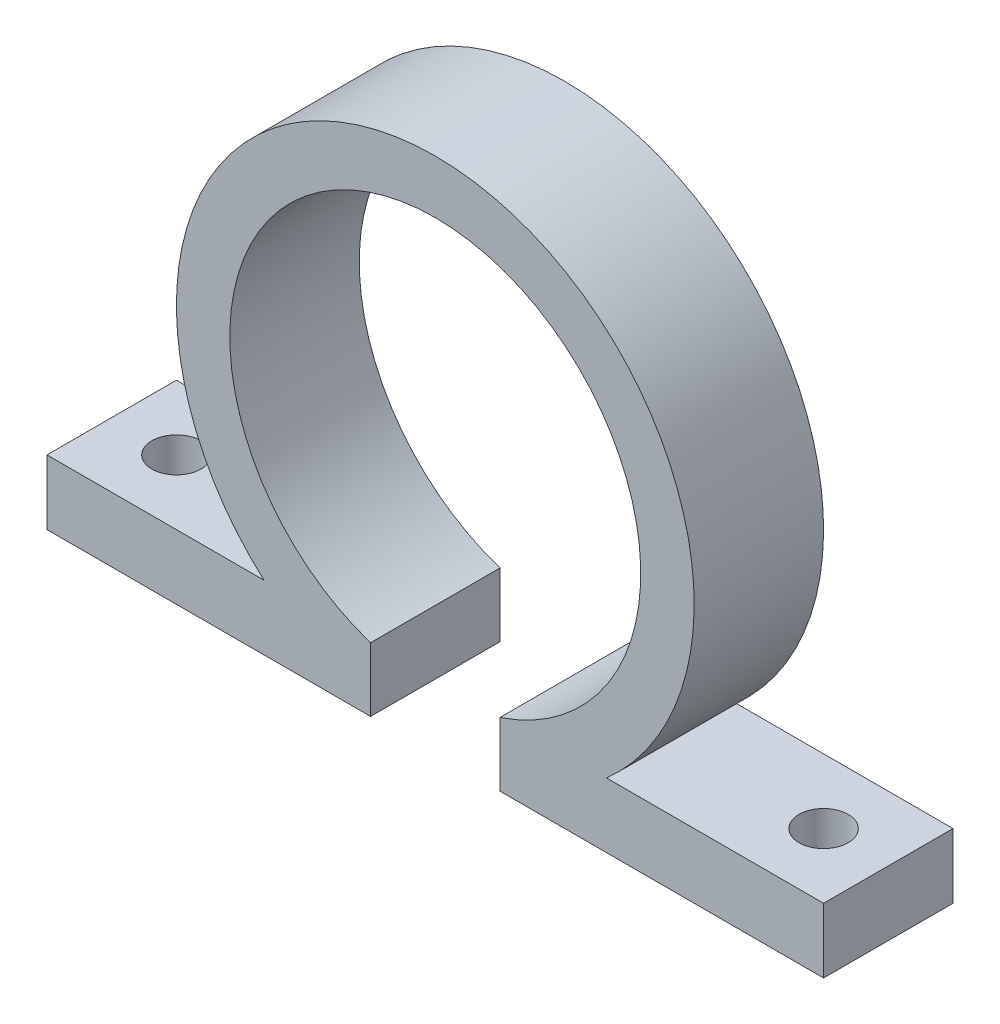
ISO-10303-21;
HEADER;
FILE_DESCRIPTION(('STEP AP214'),'2;1');
FILE_NAME('part.step','',(''),(''),'','','');
FILE_SCHEMA(('AUTOMOTIVE_DESIGN { 1 0 10303 214 1 1 1 1 }'));
ENDSEC;
DATA;
#1=APPLICATION_CONTEXT('core data for automotive mechanical design processes');
#2=APPLICATION_PROTOCOL_DEFINITION('international standard','automotive_design',2000,#1);
#3=PRODUCT_CONTEXT('',#1,'mechanical');
#4=PRODUCT('Part','Part','',(#3));
#5=PRODUCT_RELATED_PRODUCT_CATEGORY('part','',(#4));
#6=PRODUCT_DEFINITION_FORMATION('','',#4);
#7=PRODUCT_DEFINITION_CONTEXT('part definition',#1,'design');
#8=PRODUCT_DEFINITION('design','',#6,#7);
#9=PRODUCT_DEFINITION_SHAPE('','',#8);
#10=(LENGTH_UNIT() NAMED_UNIT(*) SI_UNIT(.MILLI.,.METRE.));
#11=(NAMED_UNIT(*) PLANE_ANGLE_UNIT() SI_UNIT($,.RADIAN.));
#12=(NAMED_UNIT(*) SI_UNIT($,.STERADIAN.) SOLID_ANGLE_UNIT());
#13=UNCERTAINTY_MEASURE_WITH_UNIT(LENGTH_MEASURE(1.E-05),#10,'distance_accuracy_value','');
#14=(GEOMETRIC_REPRESENTATION_CONTEXT(3) GLOBAL_UNCERTAINTY_ASSIGNED_CONTEXT((#13)) GLOBAL_UNIT_ASSIGNED_CONTEXT((#10,
#11,#12)) REPRESENTATION_CONTEXT('',''));
#15=CARTESIAN_POINT('',(0.,0.,0.));
#16=DIRECTION('',(0.,0.,1.));
#17=DIRECTION('',(1.,0.,0.));
#18=AXIS2_PLACEMENT_3D('',#15,#16,#17);
#19=CARTESIAN_POINT('',(-30.,-20.,10.));
#20=DIRECTION('',(0.,-1.,0.));
#21=DIRECTION('',(1.,0.,0.));
#22=AXIS2_PLACEMENT_3D('',#19,#20,#21);
#23=PLANE('',#22);
#24=CARTESIAN_POINT('',(-25.,-20.,5.));
#25=DIRECTION('',(0.,1.,0.));
#26=DIRECTION('',(0.,0.,1.));
#27=AXIS2_PLACEMENT_3D('',#24,#25,#26);
#28=CIRCLE('',#27,1.89865);
#29=CARTESIAN_POINT('',(-25.,-20.,6.89865));
#30=VERTEX_POINT('',#29);
#31=EDGE_CURVE('E190',#30,#30,#28,.T.);
#32=ORIENTED_EDGE('',*,*,#31,.T.);
#33=EDGE_LOOP('',(#32));
#34=FACE_BOUND('',#33,.T.);
#35=DIRECTION('',(0.,0.,1.));
#36=VECTOR('',#35,1.);
#37=CARTESIAN_POINT('',(-5.,-20.,0.));
#38=LINE('',#37,#36);
#39=CARTESIAN_POINT('',(-5.,-20.,0.));
#40=VERTEX_POINT('',#39);
#41=CARTESIAN_POINT('',(-5.,-20.,10.));
#42=VERTEX_POINT('',#41);
#43=EDGE_CURVE('E107',#40,#42,#38,.T.);
#44=ORIENTED_EDGE('',*,*,#43,.T.);
#45=DIRECTION('',(-1.,0.,0.));
#46=VECTOR('',#45,1.);
#47=CARTESIAN_POINT('',(-30.,-20.,10.));
#48=LINE('',#47,#46);
#49=CARTESIAN_POINT('',(-30.,-20.,10.));
#50=VERTEX_POINT('',#49);
#51=EDGE_CURVE('E172',#42,#50,#48,.T.);
#52=ORIENTED_EDGE('',*,*,#51,.T.);
#53=DIRECTION('',(0.,0.,-1.));
#54=VECTOR('',#53,1.);
#55=CARTESIAN_POINT('',(-30.,-20.,10.));
#56=LINE('',#55,#54);
#57=CARTESIAN_POINT('',(-30.,-20.,0.));
#58=VERTEX_POINT('',#57);
#59=EDGE_CURVE('E128',#50,#58,#56,.T.);
#60=ORIENTED_EDGE('',*,*,#59,.T.);
#61=DIRECTION('',(-1.,0.,0.));
#62=VECTOR('',#61,1.);
#63=CARTESIAN_POINT('',(-30.,-20.,0.));
#64=LINE('',#63,#62);
#65=EDGE_CURVE('E121',#40,#58,#64,.T.);
#66=ORIENTED_EDGE('',*,*,#65,.F.);
#67=EDGE_LOOP('',(#44,#52,#60,#66));
#68=FACE_BOUND('',#67,.T.);
#69=ADVANCED_FACE('F32',(#34,#68),#23,.T.);
#70=CARTESIAN_POINT('',(0.,0.,10.));
#71=DIRECTION('',(0.,0.,-1.));
#72=DIRECTION('',(-1.,0.,0.));
#73=AXIS2_PLACEMENT_3D('',#70,#71,#72);
#74=CYLINDRICAL_SURFACE('',#73,20.);
#75=CARTESIAN_POINT('',(0.,0.,10.));
#76=DIRECTION('',(0.,0.,1.));
#77=DIRECTION('',(1.,0.,0.));
#78=AXIS2_PLACEMENT_3D('',#75,#76,#77);
#79=CIRCLE('',#78,20.);
#80=CARTESIAN_POINT('',(13.228756555323,-15.,10.));
#81=VERTEX_POINT('',#80);
#82=CARTESIAN_POINT('',(-13.228756555323,-15.,10.));
#83=VERTEX_POINT('',#82);
#84=EDGE_CURVE('E11',#81,#83,#79,.T.);
#85=ORIENTED_EDGE('',*,*,#84,.F.);
#86=DIRECTION('',(0.,0.,-1.));
#87=VECTOR('',#86,1.);
#88=CARTESIAN_POINT('',(13.228756555323,-15.,10.));
#89=LINE('',#88,#87);
#90=CARTESIAN_POINT('',(13.2287565553229,-15.,0.));
#91=VERTEX_POINT('',#90);
#92=EDGE_CURVE('E152',#81,#91,#89,.T.);
#93=ORIENTED_EDGE('',*,*,#92,.T.);
#94=CARTESIAN_POINT('',(0.,0.,0.));
#95=DIRECTION('',(0.,0.,1.));
#96=DIRECTION('',(1.,0.,0.));
#97=AXIS2_PLACEMENT_3D('',#94,#95,#96);
#98=CIRCLE('',#97,20.);
#99=CARTESIAN_POINT('',(-13.228756555323,-15.,0.));
#100=VERTEX_POINT('',#99);
#101=EDGE_CURVE('E36',#91,#100,#98,.T.);
#102=ORIENTED_EDGE('',*,*,#101,.T.);
#103=DIRECTION('',(0.,0.,-1.));
#104=VECTOR('',#103,1.);
#105=CARTESIAN_POINT('',(-13.228756555323,-15.,10.));
#106=LINE('',#105,#104);
#107=EDGE_CURVE('E141',#100,#83,#106,.F.);
#108=ORIENTED_EDGE('',*,*,#107,.T.);
#109=EDGE_LOOP('',(#85,#93,#102,#108));
#110=FACE_BOUND('',#109,.T.);
#111=ADVANCED_FACE('F34',(#110),#74,.T.);
#112=CARTESIAN_POINT('',(0.,0.,10.));
#113=DIRECTION('',(0.,0.,1.));
#114=DIRECTION('',(1.,0.,0.));
#115=AXIS2_PLACEMENT_3D('',#112,#113,#114);
#116=PLANE('',#115);
#117=DIRECTION('',(0.,-1.,0.));
#118=VECTOR('',#117,1.);
#119=CARTESIAN_POINT('',(-5.,-15.0670376982338,10.));
#120=LINE('',#119,#118);
#121=CARTESIAN_POINT('',(-5.,-15.0670376982338,10.));
#122=VERTEX_POINT('',#121);
#123=EDGE_CURVE('E110',#122,#42,#120,.T.);
#124=ORIENTED_EDGE('',*,*,#123,.F.);
#125=CARTESIAN_POINT('',(0.,0.,10.));
#126=DIRECTION('',(0.,0.,-1.));
#127=DIRECTION('',(-1.,0.,0.));
#128=AXIS2_PLACEMENT_3D('',#125,#126,#127);
#129=CIRCLE('',#128,15.875);
#130=CARTESIAN_POINT('',(5.,-15.0670376982339,10.));
#131=VERTEX_POINT('',#130);
#132=EDGE_CURVE('E169',#122,#131,#129,.T.);
#133=ORIENTED_EDGE('',*,*,#132,.T.);
#134=DIRECTION('',(0.,1.,0.));
#135=VECTOR('',#134,1.);
#136=CARTESIAN_POINT('',(5.,-15.0670376982339,10.));
#137=LINE('',#136,#135);
#138=CARTESIAN_POINT('',(5.,-20.,10.));
#139=VERTEX_POINT('',#138);
#140=EDGE_CURVE('E55',#139,#131,#137,.T.);
#141=ORIENTED_EDGE('',*,*,#140,.F.);
#142=CARTESIAN_POINT('',(30.,-20.,10.));
#143=VERTEX_POINT('',#142);
#144=EDGE_CURVE('E150',#143,#139,#48,.T.);
#145=ORIENTED_EDGE('',*,*,#144,.F.);
#146=DIRECTION('',(0.,-1.,0.));
#147=VECTOR('',#146,1.);
#148=CARTESIAN_POINT('',(30.,-15.,10.));
#149=LINE('',#148,#147);
#150=CARTESIAN_POINT('',(30.,-15.,10.));
#151=VERTEX_POINT('',#150);
#152=EDGE_CURVE('E173',#151,#143,#149,.T.);
#153=ORIENTED_EDGE('',*,*,#152,.F.);
#154=DIRECTION('',(1.,0.,0.));
#155=VECTOR('',#154,1.);
#156=CARTESIAN_POINT('',(-30.,-15.,10.));
#157=LINE('',#156,#155);
#158=EDGE_CURVE('E177',#81,#151,#157,.T.);
#159=ORIENTED_EDGE('',*,*,#158,.F.);
#160=ORIENTED_EDGE('',*,*,#84,.T.);
#161=CARTESIAN_POINT('',(-30.,-15.,10.));
#162=VERTEX_POINT('',#161);
#163=EDGE_CURVE('E164',#162,#83,#157,.T.);
#164=ORIENTED_EDGE('',*,*,#163,.F.);
#165=DIRECTION('',(0.,1.,0.));
#166=VECTOR('',#165,1.);
#167=CARTESIAN_POINT('',(-30.,-15.,10.));
#168=LINE('',#167,#166);
#169=EDGE_CURVE('E134',#50,#162,#168,.T.);
#170=ORIENTED_EDGE('',*,*,#169,.F.);
#171=ORIENTED_EDGE('',*,*,#51,.F.);
#172=EDGE_LOOP('',(#124,#133,#141,#145,#153,#159,#160,#164,#170,#171));
#173=FACE_BOUND('',#172,.T.);
#174=ADVANCED_FACE('F215',(#173),#116,.T.);
#175=CARTESIAN_POINT('',(0.,0.,0.));
#176=DIRECTION('',(0.,0.,1.));
#177=DIRECTION('',(1.,0.,0.));
#178=AXIS2_PLACEMENT_3D('',#175,#176,#177);
#179=PLANE('',#178);
#180=CARTESIAN_POINT('',(0.,0.,0.));
#181=DIRECTION('',(0.,0.,-1.));
#182=DIRECTION('',(-1.,0.,0.));
#183=AXIS2_PLACEMENT_3D('',#180,#181,#182);
#184=CIRCLE('',#183,15.875);
#185=CARTESIAN_POINT('',(-5.00000000000001,-15.0670376982338,0.));
#186=VERTEX_POINT('',#185);
#187=CARTESIAN_POINT('',(5.,-15.0670376982339,0.));
#188=VERTEX_POINT('',#187);
#189=EDGE_CURVE('E125',#186,#188,#184,.T.);
#190=ORIENTED_EDGE('',*,*,#189,.F.);
#191=DIRECTION('',(0.,-1.,0.));
#192=VECTOR('',#191,1.);
#193=CARTESIAN_POINT('',(-5.,-15.0670376982338,0.));
#194=LINE('',#193,#192);
#195=EDGE_CURVE('E47',#186,#40,#194,.T.);
#196=ORIENTED_EDGE('',*,*,#195,.T.);
#197=ORIENTED_EDGE('',*,*,#65,.T.);
#198=DIRECTION('',(0.,1.,0.));
#199=VECTOR('',#198,1.);
#200=CARTESIAN_POINT('',(-30.,-15.,0.));
#201=LINE('',#200,#199);
#202=CARTESIAN_POINT('',(-30.,-15.,0.));
#203=VERTEX_POINT('',#202);
#204=EDGE_CURVE('E165',#58,#203,#201,.T.);
#205=ORIENTED_EDGE('',*,*,#204,.T.);
#206=DIRECTION('',(1.,0.,0.));
#207=VECTOR('',#206,1.);
#208=CARTESIAN_POINT('',(-30.,-15.,0.));
#209=LINE('',#208,#207);
#210=EDGE_CURVE('E136',#203,#100,#209,.T.);
#211=ORIENTED_EDGE('',*,*,#210,.T.);
#212=ORIENTED_EDGE('',*,*,#101,.F.);
#213=CARTESIAN_POINT('',(30.,-15.,0.));
#214=VERTEX_POINT('',#213);
#215=EDGE_CURVE('E166',#91,#214,#209,.T.);
#216=ORIENTED_EDGE('',*,*,#215,.T.);
#217=DIRECTION('',(0.,-1.,0.));
#218=VECTOR('',#217,1.);
#219=CARTESIAN_POINT('',(30.,-15.,0.));
#220=LINE('',#219,#218);
#221=CARTESIAN_POINT('',(30.,-20.,0.));
#222=VERTEX_POINT('',#221);
#223=EDGE_CURVE('E131',#214,#222,#220,.T.);
#224=ORIENTED_EDGE('',*,*,#223,.T.);
#225=CARTESIAN_POINT('',(5.,-20.,0.));
#226=VERTEX_POINT('',#225);
#227=EDGE_CURVE('E130',#222,#226,#64,.T.);
#228=ORIENTED_EDGE('',*,*,#227,.T.);
#229=DIRECTION('',(0.,1.,0.));
#230=VECTOR('',#229,1.);
#231=CARTESIAN_POINT('',(5.,-15.0670376982339,0.));
#232=LINE('',#231,#230);
#233=EDGE_CURVE('E115',#226,#188,#232,.T.);
#234=ORIENTED_EDGE('',*,*,#233,.T.);
#235=EDGE_LOOP('',(#190,#196,#197,#205,#211,#212,#216,#224,#228,#234));
#236=FACE_BOUND('',#235,.T.);
#237=ADVANCED_FACE('F119',(#236),#179,.F.);
#238=CARTESIAN_POINT('',(25.,-20.,5.));
#239=DIRECTION('',(0.,1.,0.));
#240=DIRECTION('',(0.,0.,1.));
#241=AXIS2_PLACEMENT_3D('',#238,#239,#240);
#242=CIRCLE('',#241,1.89865);
#243=CARTESIAN_POINT('',(25.,-20.,6.89865));
#244=VERTEX_POINT('',#243);
#245=EDGE_CURVE('E197',#244,#244,#242,.T.);
#246=ORIENTED_EDGE('',*,*,#245,.T.);
#247=EDGE_LOOP('',(#246));
#248=FACE_BOUND('',#247,.T.);
#249=DIRECTION('',(0.,0.,1.));
#250=VECTOR('',#249,1.);
#251=CARTESIAN_POINT('',(5.,-20.,0.));
#252=LINE('',#251,#250);
#253=EDGE_CURVE('E114',#226,#139,#252,.T.);
#254=ORIENTED_EDGE('',*,*,#253,.F.);
#255=ORIENTED_EDGE('',*,*,#227,.F.);
#256=DIRECTION('',(0.,0.,-1.));
#257=VECTOR('',#256,1.);
#258=CARTESIAN_POINT('',(30.,-20.,10.));
#259=LINE('',#258,#257);
#260=EDGE_CURVE('E142',#143,#222,#259,.T.);
#261=ORIENTED_EDGE('',*,*,#260,.F.);
#262=ORIENTED_EDGE('',*,*,#144,.T.);
#263=EDGE_LOOP('',(#254,#255,#261,#262));
#264=FACE_BOUND('',#263,.T.);
#265=ADVANCED_FACE('F209',(#248,#264),#23,.T.);
#266=CARTESIAN_POINT('',(-30.,-15.,10.));
#267=DIRECTION('',(0.,1.,0.));
#268=DIRECTION('',(-1.,0.,0.));
#269=AXIS2_PLACEMENT_3D('',#266,#267,#268);
#270=PLANE('',#269);
#271=CARTESIAN_POINT('',(25.,-15.,5.));
#272=DIRECTION('',(0.,1.,0.));
#273=DIRECTION('',(0.,0.,1.));
#274=AXIS2_PLACEMENT_3D('',#271,#272,#273);
#275=CIRCLE('',#274,1.89865);
#276=CARTESIAN_POINT('',(25.,-15.,6.89865));
#277=VERTEX_POINT('',#276);
#278=EDGE_CURVE('E200',#277,#277,#275,.T.);
#279=ORIENTED_EDGE('',*,*,#278,.F.);
#280=EDGE_LOOP('',(#279));
#281=FACE_BOUND('',#280,.T.);
#282=ORIENTED_EDGE('',*,*,#92,.F.);
#283=ORIENTED_EDGE('',*,*,#158,.T.);
#284=DIRECTION('',(0.,0.,-1.));
#285=VECTOR('',#284,1.);
#286=CARTESIAN_POINT('',(30.,-15.,10.));
#287=LINE('',#286,#285);
#288=EDGE_CURVE('E145',#151,#214,#287,.T.);
#289=ORIENTED_EDGE('',*,*,#288,.T.);
#290=ORIENTED_EDGE('',*,*,#215,.F.);
#291=EDGE_LOOP('',(#282,#283,#289,#290));
#292=FACE_BOUND('',#291,.T.);
#293=ADVANCED_FACE('F206',(#281,#292),#270,.T.);
#294=CARTESIAN_POINT('',(-25.,-15.,5.));
#295=DIRECTION('',(0.,1.,0.));
#296=DIRECTION('',(0.,0.,1.));
#297=AXIS2_PLACEMENT_3D('',#294,#295,#296);
#298=CIRCLE('',#297,1.89865);
#299=CARTESIAN_POINT('',(-25.,-15.,6.89865));
#300=VERTEX_POINT('',#299);
#301=EDGE_CURVE('E194',#300,#300,#298,.T.);
#302=ORIENTED_EDGE('',*,*,#301,.F.);
#303=EDGE_LOOP('',(#302));
#304=FACE_BOUND('',#303,.T.);
#305=ORIENTED_EDGE('',*,*,#107,.F.);
#306=ORIENTED_EDGE('',*,*,#210,.F.);
#307=DIRECTION('',(0.,0.,-1.));
#308=VECTOR('',#307,1.);
#309=CARTESIAN_POINT('',(-30.,-15.,10.));
#310=LINE('',#309,#308);
#311=EDGE_CURVE('E148',#162,#203,#310,.T.);
#312=ORIENTED_EDGE('',*,*,#311,.F.);
#313=ORIENTED_EDGE('',*,*,#163,.T.);
#314=EDGE_LOOP('',(#305,#306,#312,#313));
#315=FACE_BOUND('',#314,.T.);
#316=ADVANCED_FACE('F162',(#304,#315),#270,.T.);
#317=CARTESIAN_POINT('',(-30.,-15.,10.));
#318=DIRECTION('',(-1.,0.,0.));
#319=DIRECTION('',(0.,0.,1.));
#320=AXIS2_PLACEMENT_3D('',#317,#318,#319);
#321=PLANE('',#320);
#322=ORIENTED_EDGE('',*,*,#204,.F.);
#323=ORIENTED_EDGE('',*,*,#59,.F.);
#324=ORIENTED_EDGE('',*,*,#169,.T.);
#325=ORIENTED_EDGE('',*,*,#311,.T.);
#326=EDGE_LOOP('',(#322,#323,#324,#325));
#327=FACE_BOUND('',#326,.T.);
#328=ADVANCED_FACE('F233',(#327),#321,.T.);
#329=CARTESIAN_POINT('',(30.,-15.,10.));
#330=DIRECTION('',(1.,0.,0.));
#331=DIRECTION('',(0.,0.,-1.));
#332=AXIS2_PLACEMENT_3D('',#329,#330,#331);
#333=PLANE('',#332);
#334=ORIENTED_EDGE('',*,*,#223,.F.);
#335=ORIENTED_EDGE('',*,*,#288,.F.);
#336=ORIENTED_EDGE('',*,*,#152,.T.);
#337=ORIENTED_EDGE('',*,*,#260,.T.);
#338=EDGE_LOOP('',(#334,#335,#336,#337));
#339=FACE_BOUND('',#338,.T.);
#340=ADVANCED_FACE('F219',(#339),#333,.T.);
#341=CARTESIAN_POINT('',(0.,0.,10.));
#342=DIRECTION('',(0.,0.,-1.));
#343=DIRECTION('',(-1.,0.,0.));
#344=AXIS2_PLACEMENT_3D('',#341,#342,#343);
#345=CYLINDRICAL_SURFACE('',#344,15.875);
#346=ORIENTED_EDGE('',*,*,#132,.F.);
#347=DIRECTION('',(0.,0.,1.));
#348=VECTOR('',#347,1.);
#349=CARTESIAN_POINT('',(-5.,-15.0670376982338,0.));
#350=LINE('',#349,#348);
#351=EDGE_CURVE('E181',#186,#122,#350,.T.);
#352=ORIENTED_EDGE('',*,*,#351,.F.);
#353=ORIENTED_EDGE('',*,*,#189,.T.);
#354=DIRECTION('',(0.,0.,1.));
#355=VECTOR('',#354,1.);
#356=CARTESIAN_POINT('',(5.,-15.0670376982339,0.));
#357=LINE('',#356,#355);
#358=EDGE_CURVE('E185',#188,#131,#357,.T.);
#359=ORIENTED_EDGE('',*,*,#358,.T.);
#360=EDGE_LOOP('',(#346,#352,#353,#359));
#361=FACE_BOUND('',#360,.T.);
#362=ADVANCED_FACE('F225',(#361),#345,.F.);
#363=CARTESIAN_POINT('',(5.,-15.0670376982339,0.));
#364=DIRECTION('',(1.,0.,0.));
#365=DIRECTION('',(0.,1.,0.));
#366=AXIS2_PLACEMENT_3D('',#363,#364,#365);
#367=PLANE('',#366);
#368=ORIENTED_EDGE('',*,*,#140,.T.);
#369=ORIENTED_EDGE('',*,*,#358,.F.);
#370=ORIENTED_EDGE('',*,*,#233,.F.);
#371=ORIENTED_EDGE('',*,*,#253,.T.);
#372=EDGE_LOOP('',(#368,#369,#370,#371));
#373=FACE_BOUND('',#372,.T.);
#374=ADVANCED_FACE('F222',(#373),#367,.F.);
#375=CARTESIAN_POINT('',(-5.,-15.0670376982338,0.));
#376=DIRECTION('',(-1.,0.,0.));
#377=DIRECTION('',(0.,-1.,0.));
#378=AXIS2_PLACEMENT_3D('',#375,#376,#377);
#379=PLANE('',#378);
#380=ORIENTED_EDGE('',*,*,#123,.T.);
#381=ORIENTED_EDGE('',*,*,#43,.F.);
#382=ORIENTED_EDGE('',*,*,#195,.F.);
#383=ORIENTED_EDGE('',*,*,#351,.T.);
#384=EDGE_LOOP('',(#380,#381,#382,#383));
#385=FACE_BOUND('',#384,.T.);
#386=ADVANCED_FACE('F108',(#385),#379,.F.);
#387=CARTESIAN_POINT('',(-25.,-15.,5.));
#388=DIRECTION('',(0.,1.,0.));
#389=DIRECTION('',(0.,0.,1.));
#390=AXIS2_PLACEMENT_3D('',#387,#388,#389);
#391=CYLINDRICAL_SURFACE('',#390,1.89865);
#392=ORIENTED_EDGE('',*,*,#31,.F.);
#393=EDGE_LOOP('',(#392));
#394=FACE_BOUND('',#393,.T.);
#395=ORIENTED_EDGE('',*,*,#301,.T.);
#396=EDGE_LOOP('',(#395));
#397=FACE_BOUND('',#396,.T.);
#398=ADVANCED_FACE('F250',(#394,#397),#391,.F.);
#399=CARTESIAN_POINT('',(25.,-15.,5.));
#400=DIRECTION('',(0.,1.,0.));
#401=DIRECTION('',(0.,0.,1.));
#402=AXIS2_PLACEMENT_3D('',#399,#400,#401);
#403=CYLINDRICAL_SURFACE('',#402,1.89865);
#404=ORIENTED_EDGE('',*,*,#245,.F.);
#405=EDGE_LOOP('',(#404));
#406=FACE_BOUND('',#405,.T.);
#407=ORIENTED_EDGE('',*,*,#278,.T.);
#408=EDGE_LOOP('',(#407));
#409=FACE_BOUND('',#408,.T.);
#410=ADVANCED_FACE('F204',(#406,#409),#403,.F.);
#411=CLOSED_SHELL('',(#69,#111,#174,#237,#265,#293,#316,#328,#340,#362,#374,#386,#398,#410));
#412=MANIFOLD_SOLID_BREP('B2',#411);
#413=ADVANCED_BREP_SHAPE_REPRESENTATION('',(#18,#412),#14);
#414=SHAPE_DEFINITION_REPRESENTATION(#9,#413);
ENDSEC;
END-ISO-10303-21;
